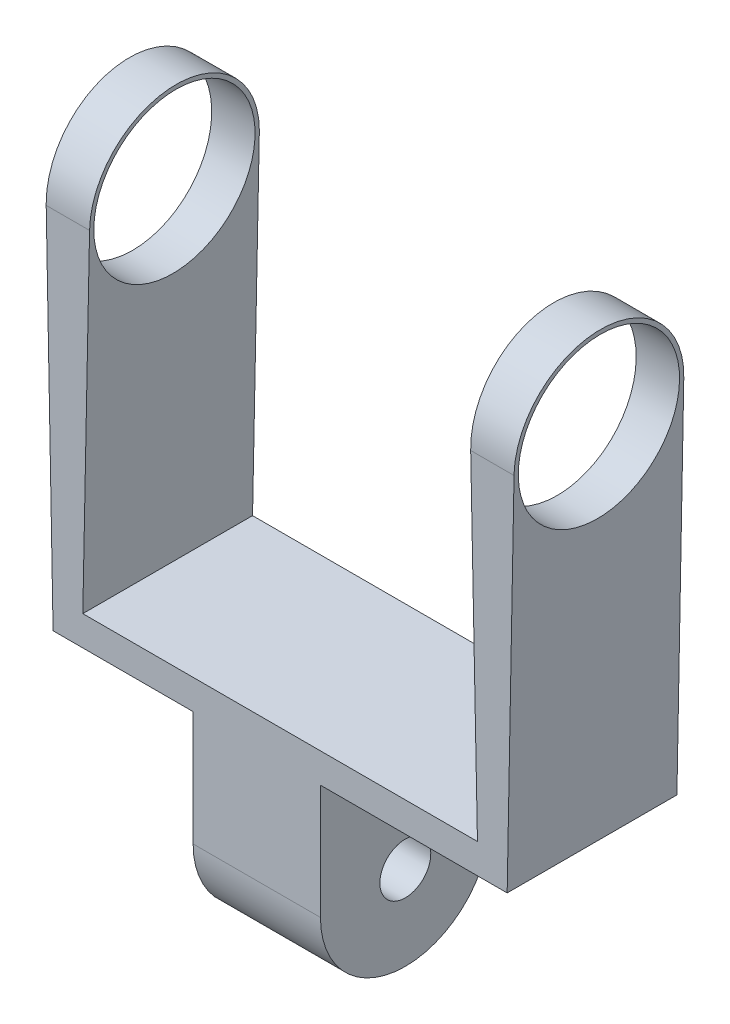
ISO-10303-21;
HEADER;
FILE_DESCRIPTION(('STEP AP214'),'2;1');
FILE_NAME('part.step','',(''),(''),'','','');
FILE_SCHEMA(('AUTOMOTIVE_DESIGN { 1 0 10303 214 1 1 1 1 }'));
ENDSEC;
DATA;
#1=APPLICATION_CONTEXT('core data for automotive mechanical design processes');
#2=APPLICATION_PROTOCOL_DEFINITION('international standard','automotive_design',2000,#1);
#3=PRODUCT_CONTEXT('',#1,'mechanical');
#4=PRODUCT('Part','Part','',(#3));
#5=PRODUCT_RELATED_PRODUCT_CATEGORY('part','',(#4));
#6=PRODUCT_DEFINITION_FORMATION('','',#4);
#7=PRODUCT_DEFINITION_CONTEXT('part definition',#1,'design');
#8=PRODUCT_DEFINITION('design','',#6,#7);
#9=PRODUCT_DEFINITION_SHAPE('','',#8);
#10=(LENGTH_UNIT() NAMED_UNIT(*) SI_UNIT(.MILLI.,.METRE.));
#11=(NAMED_UNIT(*) PLANE_ANGLE_UNIT() SI_UNIT($,.RADIAN.));
#12=(NAMED_UNIT(*) SI_UNIT($,.STERADIAN.) SOLID_ANGLE_UNIT());
#13=UNCERTAINTY_MEASURE_WITH_UNIT(LENGTH_MEASURE(1.E-05),#10,'distance_accuracy_value','');
#14=(GEOMETRIC_REPRESENTATION_CONTEXT(3) GLOBAL_UNCERTAINTY_ASSIGNED_CONTEXT((#13)) GLOBAL_UNIT_ASSIGNED_CONTEXT((#10,
#11,#12)) REPRESENTATION_CONTEXT('',''));
#15=CARTESIAN_POINT('',(0.,0.,0.));
#16=DIRECTION('',(0.,0.,1.));
#17=DIRECTION('',(1.,0.,0.));
#18=AXIS2_PLACEMENT_3D('',#15,#16,#17);
#19=CARTESIAN_POINT('',(33.,-47.,40.));
#20=DIRECTION('',(1.,0.,0.));
#21=DIRECTION('',(0.,0.,-1.));
#22=AXIS2_PLACEMENT_3D('',#19,#20,#21);
#23=PLANE('',#22);
#24=CARTESIAN_POINT('',(33.,-27.,20.));
#25=DIRECTION('',(-1.,0.,0.));
#26=DIRECTION('',(0.,-1.,0.));
#27=AXIS2_PLACEMENT_3D('',#24,#25,#26);
#28=CIRCLE('',#27,5.99999999999999);
#29=CARTESIAN_POINT('',(33.,-33.,20.));
#30=VERTEX_POINT('',#29);
#31=EDGE_CURVE('E338',#30,#30,#28,.T.);
#32=ORIENTED_EDGE('',*,*,#31,.F.);
#33=EDGE_LOOP('',(#32));
#34=FACE_BOUND('',#33,.T.);
#35=DIRECTION('',(0.,1.,0.));
#36=VECTOR('',#35,1.);
#37=CARTESIAN_POINT('',(33.,-47.,0.));
#38=LINE('',#37,#36);
#39=CARTESIAN_POINT('',(33.,-27.,0.));
#40=VERTEX_POINT('',#39);
#41=CARTESIAN_POINT('',(33.,0.,0.));
#42=VERTEX_POINT('',#41);
#43=EDGE_CURVE('E146',#40,#42,#38,.T.);
#44=ORIENTED_EDGE('',*,*,#43,.F.);
#45=CARTESIAN_POINT('',(33.,-27.,20.));
#46=DIRECTION('',(-1.,0.,0.));
#47=DIRECTION('',(0.,0.,1.));
#48=AXIS2_PLACEMENT_3D('',#45,#46,#47);
#49=CIRCLE('',#48,20.);
#50=CARTESIAN_POINT('',(33.,-27.,40.));
#51=VERTEX_POINT('',#50);
#52=EDGE_CURVE('E214',#40,#51,#49,.T.);
#53=ORIENTED_EDGE('',*,*,#52,.T.);
#54=DIRECTION('',(0.,1.,0.));
#55=VECTOR('',#54,1.);
#56=CARTESIAN_POINT('',(33.,-47.,40.));
#57=LINE('',#56,#55);
#58=CARTESIAN_POINT('',(33.,0.,40.));
#59=VERTEX_POINT('',#58);
#60=EDGE_CURVE('E139',#51,#59,#57,.T.);
#61=ORIENTED_EDGE('',*,*,#60,.T.);
#62=DIRECTION('',(0.,0.,-1.));
#63=VECTOR('',#62,1.);
#64=CARTESIAN_POINT('',(33.,0.,40.));
#65=LINE('',#64,#63);
#66=EDGE_CURVE('E223',#59,#42,#65,.T.);
#67=ORIENTED_EDGE('',*,*,#66,.T.);
#68=EDGE_LOOP('',(#44,#53,#61,#67));
#69=FACE_BOUND('',#68,.T.);
#70=ADVANCED_FACE('F123',(#34,#69),#23,.F.);
#71=CARTESIAN_POINT('',(63.,-47.,40.));
#72=DIRECTION('',(-1.,0.,0.));
#73=DIRECTION('',(0.,-1.,0.));
#74=AXIS2_PLACEMENT_3D('',#71,#72,#73);
#75=PLANE('',#74);
#76=CARTESIAN_POINT('',(63.,-27.,20.));
#77=DIRECTION('',(-1.,0.,0.));
#78=DIRECTION('',(0.,-1.,0.));
#79=AXIS2_PLACEMENT_3D('',#76,#77,#78);
#80=CIRCLE('',#79,5.99999999999999);
#81=CARTESIAN_POINT('',(63.,-33.,20.));
#82=VERTEX_POINT('',#81);
#83=EDGE_CURVE('E127',#82,#82,#80,.T.);
#84=ORIENTED_EDGE('',*,*,#83,.T.);
#85=EDGE_LOOP('',(#84));
#86=FACE_BOUND('',#85,.T.);
#87=CARTESIAN_POINT('',(63.,-27.,20.));
#88=DIRECTION('',(-1.,0.,0.));
#89=DIRECTION('',(0.,-1.,0.));
#90=AXIS2_PLACEMENT_3D('',#87,#88,#89);
#91=CIRCLE('',#90,20.);
#92=CARTESIAN_POINT('',(63.,-27.,0.));
#93=VERTEX_POINT('',#92);
#94=CARTESIAN_POINT('',(63.,-27.,40.));
#95=VERTEX_POINT('',#94);
#96=EDGE_CURVE('E335',#93,#95,#91,.T.);
#97=ORIENTED_EDGE('',*,*,#96,.F.);
#98=DIRECTION('',(0.,1.,0.));
#99=VECTOR('',#98,1.);
#100=CARTESIAN_POINT('',(63.,-47.,0.));
#101=LINE('',#100,#99);
#102=CARTESIAN_POINT('',(63.,0.,0.));
#103=VERTEX_POINT('',#102);
#104=EDGE_CURVE('E222',#93,#103,#101,.T.);
#105=ORIENTED_EDGE('',*,*,#104,.T.);
#106=DIRECTION('',(0.,0.,1.));
#107=VECTOR('',#106,1.);
#108=CARTESIAN_POINT('',(63.,0.,40.));
#109=LINE('',#108,#107);
#110=CARTESIAN_POINT('',(63.,0.,40.));
#111=VERTEX_POINT('',#110);
#112=EDGE_CURVE('E329',#103,#111,#109,.T.);
#113=ORIENTED_EDGE('',*,*,#112,.T.);
#114=DIRECTION('',(0.,1.,0.));
#115=VECTOR('',#114,1.);
#116=CARTESIAN_POINT('',(63.,-47.,40.));
#117=LINE('',#116,#115);
#118=EDGE_CURVE('E228',#95,#111,#117,.T.);
#119=ORIENTED_EDGE('',*,*,#118,.F.);
#120=EDGE_LOOP('',(#97,#105,#113,#119));
#121=FACE_BOUND('',#120,.T.);
#122=ADVANCED_FACE('F345',(#86,#121),#75,.F.);
#123=CARTESIAN_POINT('',(0.,0.,0.));
#124=DIRECTION('',(0.,0.,-1.));
#125=DIRECTION('',(-1.,0.,0.));
#126=AXIS2_PLACEMENT_3D('',#123,#124,#125);
#127=PLANE('',#126);
#128=ORIENTED_EDGE('',*,*,#104,.F.);
#129=DIRECTION('',(-1.,0.,0.));
#130=VECTOR('',#129,1.);
#131=CARTESIAN_POINT('',(109.,-27.,0.));
#132=LINE('',#131,#130);
#133=EDGE_CURVE('E12',#93,#40,#132,.T.);
#134=ORIENTED_EDGE('',*,*,#133,.T.);
#135=ORIENTED_EDGE('',*,*,#43,.T.);
#136=DIRECTION('',(-1.,0.,0.));
#137=VECTOR('',#136,1.);
#138=CARTESIAN_POINT('',(107.,0.,0.));
#139=LINE('',#138,#137);
#140=CARTESIAN_POINT('',(0.,0.,0.));
#141=VERTEX_POINT('',#140);
#142=EDGE_CURVE('E276',#42,#141,#139,.T.);
#143=ORIENTED_EDGE('',*,*,#142,.T.);
#144=DIRECTION('',(0.0188645669476134,-0.999822048223522,0.));
#145=VECTOR('',#144,1.);
#146=CARTESIAN_POINT('',(-1.99999999999997,106.,0.));
#147=LINE('',#146,#145);
#148=CARTESIAN_POINT('',(-1.62264150943394,86.,0.));
#149=VERTEX_POINT('',#148);
#150=EDGE_CURVE('E279',#149,#141,#147,.T.);
#151=ORIENTED_EDGE('',*,*,#150,.F.);
#152=DIRECTION('',(1.,0.,0.));
#153=VECTOR('',#152,1.);
#154=CARTESIAN_POINT('',(-1.99999999999997,86.,0.));
#155=LINE('',#154,#153);
#156=CARTESIAN_POINT('',(8.59595959595961,86.,0.));
#157=VERTEX_POINT('',#156);
#158=EDGE_CURVE('E132',#149,#157,#155,.T.);
#159=ORIENTED_EDGE('',*,*,#158,.T.);
#160=DIRECTION('',(0.0201978990228255,0.999796001629864,0.));
#161=VECTOR('',#160,1.);
#162=CARTESIAN_POINT('',(7.00000000000002,6.99999999999999,0.));
#163=LINE('',#162,#161);
#164=CARTESIAN_POINT('',(7.00000000000002,6.99999999999999,0.));
#165=VERTEX_POINT('',#164);
#166=EDGE_CURVE('E253',#165,#157,#163,.T.);
#167=ORIENTED_EDGE('',*,*,#166,.F.);
#168=DIRECTION('',(1.,0.,0.));
#169=VECTOR('',#168,1.);
#170=CARTESIAN_POINT('',(7.00000000000002,6.99999999999999,0.));
#171=LINE('',#170,#169);
#172=CARTESIAN_POINT('',(100.,6.99999999999999,0.));
#173=VERTEX_POINT('',#172);
#174=EDGE_CURVE('E248',#165,#173,#171,.T.);
#175=ORIENTED_EDGE('',*,*,#174,.T.);
#176=DIRECTION('',(-0.0201978990228256,0.999796001629864,0.));
#177=VECTOR('',#176,1.);
#178=CARTESIAN_POINT('',(100.,6.99999999999999,0.));
#179=LINE('',#178,#177);
#180=CARTESIAN_POINT('',(98.4040404040404,86.,0.));
#181=VERTEX_POINT('',#180);
#182=EDGE_CURVE('E271',#173,#181,#179,.T.);
#183=ORIENTED_EDGE('',*,*,#182,.T.);
#184=CARTESIAN_POINT('',(108.622641509434,86.,0.));
#185=VERTEX_POINT('',#184);
#186=EDGE_CURVE('E298',#181,#185,#155,.T.);
#187=ORIENTED_EDGE('',*,*,#186,.T.);
#188=DIRECTION('',(-0.0188645669476134,-0.999822048223522,0.));
#189=VECTOR('',#188,1.);
#190=CARTESIAN_POINT('',(109.,106.,0.));
#191=LINE('',#190,#189);
#192=CARTESIAN_POINT('',(107.,0.,0.));
#193=VERTEX_POINT('',#192);
#194=EDGE_CURVE('E274',#185,#193,#191,.T.);
#195=ORIENTED_EDGE('',*,*,#194,.T.);
#196=EDGE_CURVE('E277',#193,#103,#139,.T.);
#197=ORIENTED_EDGE('',*,*,#196,.T.);
#198=EDGE_LOOP('',(#128,#134,#135,#143,#151,#159,#167,#175,#183,#187,#195,#197));
#199=FACE_BOUND('',#198,.T.);
#200=ADVANCED_FACE('F220',(#199),#127,.T.);
#201=CARTESIAN_POINT('',(0.,0.,40.));
#202=DIRECTION('',(0.,0.,-1.));
#203=DIRECTION('',(-1.,0.,0.));
#204=AXIS2_PLACEMENT_3D('',#201,#202,#203);
#205=PLANE('',#204);
#206=DIRECTION('',(-1.,0.,0.));
#207=VECTOR('',#206,1.);
#208=CARTESIAN_POINT('',(109.,-27.,40.));
#209=LINE('',#208,#207);
#210=EDGE_CURVE('E218',#95,#51,#209,.T.);
#211=ORIENTED_EDGE('',*,*,#210,.F.);
#212=ORIENTED_EDGE('',*,*,#118,.T.);
#213=DIRECTION('',(-1.,0.,0.));
#214=VECTOR('',#213,1.);
#215=CARTESIAN_POINT('',(107.,0.,40.));
#216=LINE('',#215,#214);
#217=CARTESIAN_POINT('',(107.,0.,40.));
#218=VERTEX_POINT('',#217);
#219=EDGE_CURVE('E259',#218,#111,#216,.T.);
#220=ORIENTED_EDGE('',*,*,#219,.F.);
#221=DIRECTION('',(-0.0188645669476134,-0.999822048223522,0.));
#222=VECTOR('',#221,1.);
#223=CARTESIAN_POINT('',(109.,106.,40.));
#224=LINE('',#223,#222);
#225=CARTESIAN_POINT('',(108.622641509434,86.,40.));
#226=VERTEX_POINT('',#225);
#227=EDGE_CURVE('E256',#226,#218,#224,.T.);
#228=ORIENTED_EDGE('',*,*,#227,.F.);
#229=DIRECTION('',(1.,0.,0.));
#230=VECTOR('',#229,1.);
#231=CARTESIAN_POINT('',(-1.99999999999997,86.,40.));
#232=LINE('',#231,#230);
#233=CARTESIAN_POINT('',(98.4040404040404,86.,40.));
#234=VERTEX_POINT('',#233);
#235=EDGE_CURVE('E286',#234,#226,#232,.T.);
#236=ORIENTED_EDGE('',*,*,#235,.F.);
#237=DIRECTION('',(-0.0201978990228256,0.999796001629864,0.));
#238=VECTOR('',#237,1.);
#239=CARTESIAN_POINT('',(100.,6.99999999999999,40.));
#240=LINE('',#239,#238);
#241=CARTESIAN_POINT('',(100.,6.99999999999999,40.));
#242=VERTEX_POINT('',#241);
#243=EDGE_CURVE('E252',#242,#234,#240,.T.);
#244=ORIENTED_EDGE('',*,*,#243,.F.);
#245=DIRECTION('',(1.,0.,0.));
#246=VECTOR('',#245,1.);
#247=CARTESIAN_POINT('',(7.00000000000002,6.99999999999999,40.));
#248=LINE('',#247,#246);
#249=CARTESIAN_POINT('',(7.00000000000002,6.99999999999999,40.));
#250=VERTEX_POINT('',#249);
#251=EDGE_CURVE('E249',#250,#242,#248,.T.);
#252=ORIENTED_EDGE('',*,*,#251,.F.);
#253=DIRECTION('',(0.0201978990228255,0.999796001629864,0.));
#254=VECTOR('',#253,1.);
#255=CARTESIAN_POINT('',(7.00000000000002,6.99999999999999,40.));
#256=LINE('',#255,#254);
#257=CARTESIAN_POINT('',(8.59595959595961,86.,40.));
#258=VERTEX_POINT('',#257);
#259=EDGE_CURVE('E265',#250,#258,#256,.T.);
#260=ORIENTED_EDGE('',*,*,#259,.T.);
#261=CARTESIAN_POINT('',(-1.62264150943394,86.,40.));
#262=VERTEX_POINT('',#261);
#263=EDGE_CURVE('E295',#262,#258,#232,.T.);
#264=ORIENTED_EDGE('',*,*,#263,.F.);
#265=DIRECTION('',(0.0188645669476134,-0.999822048223522,0.));
#266=VECTOR('',#265,1.);
#267=CARTESIAN_POINT('',(-1.99999999999997,106.,40.));
#268=LINE('',#267,#266);
#269=CARTESIAN_POINT('',(0.,0.,40.));
#270=VERTEX_POINT('',#269);
#271=EDGE_CURVE('E262',#262,#270,#268,.T.);
#272=ORIENTED_EDGE('',*,*,#271,.T.);
#273=EDGE_CURVE('E258',#59,#270,#216,.T.);
#274=ORIENTED_EDGE('',*,*,#273,.F.);
#275=ORIENTED_EDGE('',*,*,#60,.F.);
#276=EDGE_LOOP('',(#211,#212,#220,#228,#236,#244,#252,#260,#264,#272,#274,#275));
#277=FACE_BOUND('',#276,.T.);
#278=ADVANCED_FACE('F315',(#277),#205,.F.);
#279=CARTESIAN_POINT('',(107.,0.,40.));
#280=DIRECTION('',(0.,-1.,0.));
#281=DIRECTION('',(0.,0.,-1.));
#282=AXIS2_PLACEMENT_3D('',#279,#280,#281);
#283=PLANE('',#282);
#284=ORIENTED_EDGE('',*,*,#66,.F.);
#285=ORIENTED_EDGE('',*,*,#273,.T.);
#286=DIRECTION('',(0.,0.,-1.));
#287=VECTOR('',#286,1.);
#288=CARTESIAN_POINT('',(0.,0.,40.));
#289=LINE('',#288,#287);
#290=EDGE_CURVE('E287',#270,#141,#289,.T.);
#291=ORIENTED_EDGE('',*,*,#290,.T.);
#292=ORIENTED_EDGE('',*,*,#142,.F.);
#293=EDGE_LOOP('',(#284,#285,#291,#292));
#294=FACE_BOUND('',#293,.T.);
#295=ADVANCED_FACE('F326',(#294),#283,.T.);
#296=CARTESIAN_POINT('',(7.00000000000002,6.99999999999999,40.));
#297=DIRECTION('',(-0.999796001629864,0.0201978990228255,0.));
#298=DIRECTION('',(-0.0201978990228255,-0.999796001629864,0.));
#299=AXIS2_PLACEMENT_3D('',#296,#297,#298);
#300=PLANE('',#299);
#301=CARTESIAN_POINT('',(8.59595959595961,86.,20.));
#302=DIRECTION('',(-0.999796001629864,0.0201978990228255,0.));
#303=DIRECTION('',(0.0201978990228255,0.999796001629864,0.));
#304=AXIS2_PLACEMENT_3D('',#301,#302,#303);
#305=ELLIPSE('',#304,19.0038767598853,19.);
#306=CARTESIAN_POINT('',(8.979797979798,105.,20.));
#307=VERTEX_POINT('',#306);
#308=EDGE_CURVE('E245',#307,#307,#305,.T.);
#309=ORIENTED_EDGE('',*,*,#308,.T.);
#310=EDGE_LOOP('',(#309));
#311=FACE_BOUND('',#310,.T.);
#312=ORIENTED_EDGE('',*,*,#166,.T.);
#313=CARTESIAN_POINT('',(8.59595959595961,86.,20.));
#314=DIRECTION('',(-0.999796001629864,0.0201978990228255,0.));
#315=DIRECTION('',(0.0201978990228255,0.999796001629864,0.));
#316=AXIS2_PLACEMENT_3D('',#313,#314,#315);
#317=ELLIPSE('',#316,20.0040807998793,20.);
#318=EDGE_CURVE('E236',#258,#157,#317,.T.);
#319=ORIENTED_EDGE('',*,*,#318,.F.);
#320=ORIENTED_EDGE('',*,*,#259,.F.);
#321=DIRECTION('',(0.,0.,-1.));
#322=VECTOR('',#321,1.);
#323=CARTESIAN_POINT('',(7.00000000000002,6.99999999999999,40.));
#324=LINE('',#323,#322);
#325=EDGE_CURVE('E284',#250,#165,#324,.T.);
#326=ORIENTED_EDGE('',*,*,#325,.T.);
#327=EDGE_LOOP('',(#312,#319,#320,#326));
#328=FACE_BOUND('',#327,.T.);
#329=ADVANCED_FACE('F312',(#311,#328),#300,.F.);
#330=CARTESIAN_POINT('',(-1.99999999999997,106.,40.));
#331=DIRECTION('',(0.999822048223522,0.0188645669476134,0.));
#332=DIRECTION('',(-0.0188645669476134,0.999822048223522,0.));
#333=AXIS2_PLACEMENT_3D('',#330,#331,#332);
#334=PLANE('',#333);
#335=CARTESIAN_POINT('',(-1.62264150943394,86.,20.));
#336=DIRECTION('',(0.999822048223522,0.0188645669476134,0.));
#337=DIRECTION('',(0.0188645669476134,-0.999822048223522,0.));
#338=AXIS2_PLACEMENT_3D('',#335,#336,#337);
#339=ELLIPSE('',#338,19.00338168553,19.);
#340=CARTESIAN_POINT('',(-1.26415094339621,67.,20.));
#341=VERTEX_POINT('',#340);
#342=EDGE_CURVE('E242',#341,#341,#339,.T.);
#343=ORIENTED_EDGE('',*,*,#342,.T.);
#344=EDGE_LOOP('',(#343));
#345=FACE_BOUND('',#344,.T.);
#346=CARTESIAN_POINT('',(-1.62264150943394,86.,20.));
#347=DIRECTION('',(0.999822048223522,0.0188645669476134,0.));
#348=DIRECTION('',(0.0188645669476134,-0.999822048223522,0.));
#349=AXIS2_PLACEMENT_3D('',#346,#347,#348);
#350=ELLIPSE('',#349,20.003559668979,20.);
#351=EDGE_CURVE('E234',#149,#262,#350,.T.);
#352=ORIENTED_EDGE('',*,*,#351,.F.);
#353=ORIENTED_EDGE('',*,*,#150,.T.);
#354=ORIENTED_EDGE('',*,*,#290,.F.);
#355=ORIENTED_EDGE('',*,*,#271,.F.);
#356=EDGE_LOOP('',(#352,#353,#354,#355));
#357=FACE_BOUND('',#356,.T.);
#358=ADVANCED_FACE('F324',(#345,#357),#334,.F.);
#359=CARTESIAN_POINT('',(109.,106.,40.));
#360=DIRECTION('',(0.999822048223522,-0.0188645669476134,0.));
#361=DIRECTION('',(0.0188645669476134,0.999822048223522,0.));
#362=AXIS2_PLACEMENT_3D('',#359,#360,#361);
#363=PLANE('',#362);
#364=CARTESIAN_POINT('',(108.622641509434,86.,20.));
#365=DIRECTION('',(0.999822048223522,-0.0188645669476134,0.));
#366=DIRECTION('',(0.0188645669476134,0.999822048223522,0.));
#367=AXIS2_PLACEMENT_3D('',#364,#365,#366);
#368=ELLIPSE('',#367,19.00338168553,19.);
#369=CARTESIAN_POINT('',(108.981132075472,105.,20.));
#370=VERTEX_POINT('',#369);
#371=EDGE_CURVE('E239',#370,#370,#368,.T.);
#372=ORIENTED_EDGE('',*,*,#371,.F.);
#373=EDGE_LOOP('',(#372));
#374=FACE_BOUND('',#373,.T.);
#375=ORIENTED_EDGE('',*,*,#194,.F.);
#376=CARTESIAN_POINT('',(108.622641509434,86.,20.));
#377=DIRECTION('',(0.999822048223522,-0.0188645669476134,0.));
#378=DIRECTION('',(0.0188645669476134,0.999822048223522,0.));
#379=AXIS2_PLACEMENT_3D('',#376,#377,#378);
#380=ELLIPSE('',#379,20.003559668979,20.);
#381=EDGE_CURVE('E226',#185,#226,#380,.T.);
#382=ORIENTED_EDGE('',*,*,#381,.T.);
#383=ORIENTED_EDGE('',*,*,#227,.T.);
#384=DIRECTION('',(0.,0.,-1.));
#385=VECTOR('',#384,1.);
#386=CARTESIAN_POINT('',(107.,0.,40.));
#387=LINE('',#386,#385);
#388=EDGE_CURVE('E290',#218,#193,#387,.T.);
#389=ORIENTED_EDGE('',*,*,#388,.T.);
#390=EDGE_LOOP('',(#375,#382,#383,#389));
#391=FACE_BOUND('',#390,.T.);
#392=ADVANCED_FACE('F382',(#374,#391),#363,.T.);
#393=CARTESIAN_POINT('',(100.,6.99999999999999,40.));
#394=DIRECTION('',(-0.999796001629864,-0.0201978990228256,0.));
#395=DIRECTION('',(0.0201978990228256,-0.999796001629864,0.));
#396=AXIS2_PLACEMENT_3D('',#393,#394,#395);
#397=PLANE('',#396);
#398=CARTESIAN_POINT('',(98.4040404040404,86.,20.));
#399=DIRECTION('',(-0.999796001629864,-0.0201978990228256,0.));
#400=DIRECTION('',(0.0201978990228256,-0.999796001629864,0.));
#401=AXIS2_PLACEMENT_3D('',#398,#399,#400);
#402=ELLIPSE('',#401,19.0038767598853,19.);
#403=CARTESIAN_POINT('',(98.7878787878788,67.,20.));
#404=VERTEX_POINT('',#403);
#405=EDGE_CURVE('E238',#404,#404,#402,.T.);
#406=ORIENTED_EDGE('',*,*,#405,.F.);
#407=EDGE_LOOP('',(#406));
#408=FACE_BOUND('',#407,.T.);
#409=CARTESIAN_POINT('',(98.4040404040404,86.,20.));
#410=DIRECTION('',(-0.999796001629864,-0.0201978990228256,0.));
#411=DIRECTION('',(0.0201978990228256,-0.999796001629864,0.));
#412=AXIS2_PLACEMENT_3D('',#409,#410,#411);
#413=ELLIPSE('',#412,20.0040807998793,20.);
#414=EDGE_CURVE('E224',#234,#181,#413,.T.);
#415=ORIENTED_EDGE('',*,*,#414,.T.);
#416=ORIENTED_EDGE('',*,*,#182,.F.);
#417=DIRECTION('',(0.,0.,-1.));
#418=VECTOR('',#417,1.);
#419=CARTESIAN_POINT('',(100.,6.99999999999999,40.));
#420=LINE('',#419,#418);
#421=EDGE_CURVE('E268',#242,#173,#420,.T.);
#422=ORIENTED_EDGE('',*,*,#421,.F.);
#423=ORIENTED_EDGE('',*,*,#243,.T.);
#424=EDGE_LOOP('',(#415,#416,#422,#423));
#425=FACE_BOUND('',#424,.T.);
#426=ADVANCED_FACE('F388',(#408,#425),#397,.T.);
#427=CARTESIAN_POINT('',(7.00000000000002,6.99999999999999,40.));
#428=DIRECTION('',(0.,1.,0.));
#429=DIRECTION('',(0.,0.,1.));
#430=AXIS2_PLACEMENT_3D('',#427,#428,#429);
#431=PLANE('',#430);
#432=ORIENTED_EDGE('',*,*,#174,.F.);
#433=ORIENTED_EDGE('',*,*,#325,.F.);
#434=ORIENTED_EDGE('',*,*,#251,.T.);
#435=ORIENTED_EDGE('',*,*,#421,.T.);
#436=EDGE_LOOP('',(#432,#433,#434,#435));
#437=FACE_BOUND('',#436,.T.);
#438=ADVANCED_FACE('F125',(#437),#431,.T.);
#439=ORIENTED_EDGE('',*,*,#112,.F.);
#440=ORIENTED_EDGE('',*,*,#196,.F.);
#441=ORIENTED_EDGE('',*,*,#388,.F.);
#442=ORIENTED_EDGE('',*,*,#219,.T.);
#443=EDGE_LOOP('',(#439,#440,#441,#442));
#444=FACE_BOUND('',#443,.T.);
#445=ADVANCED_FACE('F367',(#444),#283,.T.);
#446=CARTESIAN_POINT('',(-1.99999999999997,86.,20.));
#447=DIRECTION('',(1.,0.,0.));
#448=DIRECTION('',(0.,0.,-1.));
#449=AXIS2_PLACEMENT_3D('',#446,#447,#448);
#450=CYLINDRICAL_SURFACE('',#449,20.);
#451=ORIENTED_EDGE('',*,*,#381,.F.);
#452=ORIENTED_EDGE('',*,*,#186,.F.);
#453=ORIENTED_EDGE('',*,*,#414,.F.);
#454=ORIENTED_EDGE('',*,*,#235,.T.);
#455=EDGE_LOOP('',(#451,#452,#453,#454));
#456=FACE_BOUND('',#455,.T.);
#457=ADVANCED_FACE('F364',(#456),#450,.T.);
#458=ORIENTED_EDGE('',*,*,#318,.T.);
#459=ORIENTED_EDGE('',*,*,#158,.F.);
#460=ORIENTED_EDGE('',*,*,#351,.T.);
#461=ORIENTED_EDGE('',*,*,#263,.T.);
#462=EDGE_LOOP('',(#458,#459,#460,#461));
#463=FACE_BOUND('',#462,.T.);
#464=ADVANCED_FACE('F306',(#463),#450,.T.);
#465=CARTESIAN_POINT('',(-1.99999999999997,86.,20.));
#466=DIRECTION('',(1.,0.,0.));
#467=DIRECTION('',(0.,0.,-1.));
#468=AXIS2_PLACEMENT_3D('',#465,#466,#467);
#469=CYLINDRICAL_SURFACE('',#468,19.);
#470=ORIENTED_EDGE('',*,*,#371,.T.);
#471=EDGE_LOOP('',(#470));
#472=FACE_BOUND('',#471,.T.);
#473=ORIENTED_EDGE('',*,*,#405,.T.);
#474=EDGE_LOOP('',(#473));
#475=FACE_BOUND('',#474,.T.);
#476=ADVANCED_FACE('F369',(#472,#475),#469,.F.);
#477=ORIENTED_EDGE('',*,*,#342,.F.);
#478=EDGE_LOOP('',(#477));
#479=FACE_BOUND('',#478,.T.);
#480=ORIENTED_EDGE('',*,*,#308,.F.);
#481=EDGE_LOOP('',(#480));
#482=FACE_BOUND('',#481,.T.);
#483=ADVANCED_FACE('F354',(#479,#482),#469,.F.);
#484=CARTESIAN_POINT('',(109.,-27.,20.));
#485=DIRECTION('',(-1.,0.,0.));
#486=DIRECTION('',(0.,-1.,0.));
#487=AXIS2_PLACEMENT_3D('',#484,#485,#486);
#488=CYLINDRICAL_SURFACE('',#487,20.);
#489=ORIENTED_EDGE('',*,*,#96,.T.);
#490=ORIENTED_EDGE('',*,*,#210,.T.);
#491=ORIENTED_EDGE('',*,*,#52,.F.);
#492=ORIENTED_EDGE('',*,*,#133,.F.);
#493=EDGE_LOOP('',(#489,#490,#491,#492));
#494=FACE_BOUND('',#493,.T.);
#495=ADVANCED_FACE('F215',(#494),#488,.T.);
#496=CARTESIAN_POINT('',(109.,-27.,20.));
#497=DIRECTION('',(-1.,0.,0.));
#498=DIRECTION('',(0.,-1.,0.));
#499=AXIS2_PLACEMENT_3D('',#496,#497,#498);
#500=CYLINDRICAL_SURFACE('',#499,5.99999999999999);
#501=ORIENTED_EDGE('',*,*,#31,.T.);
#502=EDGE_LOOP('',(#501));
#503=FACE_BOUND('',#502,.T.);
#504=ORIENTED_EDGE('',*,*,#83,.F.);
#505=EDGE_LOOP('',(#504));
#506=FACE_BOUND('',#505,.T.);
#507=ADVANCED_FACE('F348',(#503,#506),#500,.F.);
#508=CLOSED_SHELL('',(#70,#122,#200,#278,#295,#329,#358,#392,#426,#438,#445,#457,#464,#476,#483,
#495,#507));
#509=MANIFOLD_SOLID_BREP('B2',#508);
#510=ADVANCED_BREP_SHAPE_REPRESENTATION('',(#18,#509),#14);
#511=SHAPE_DEFINITION_REPRESENTATION(#9,#510);
ENDSEC;
END-ISO-10303-21;
